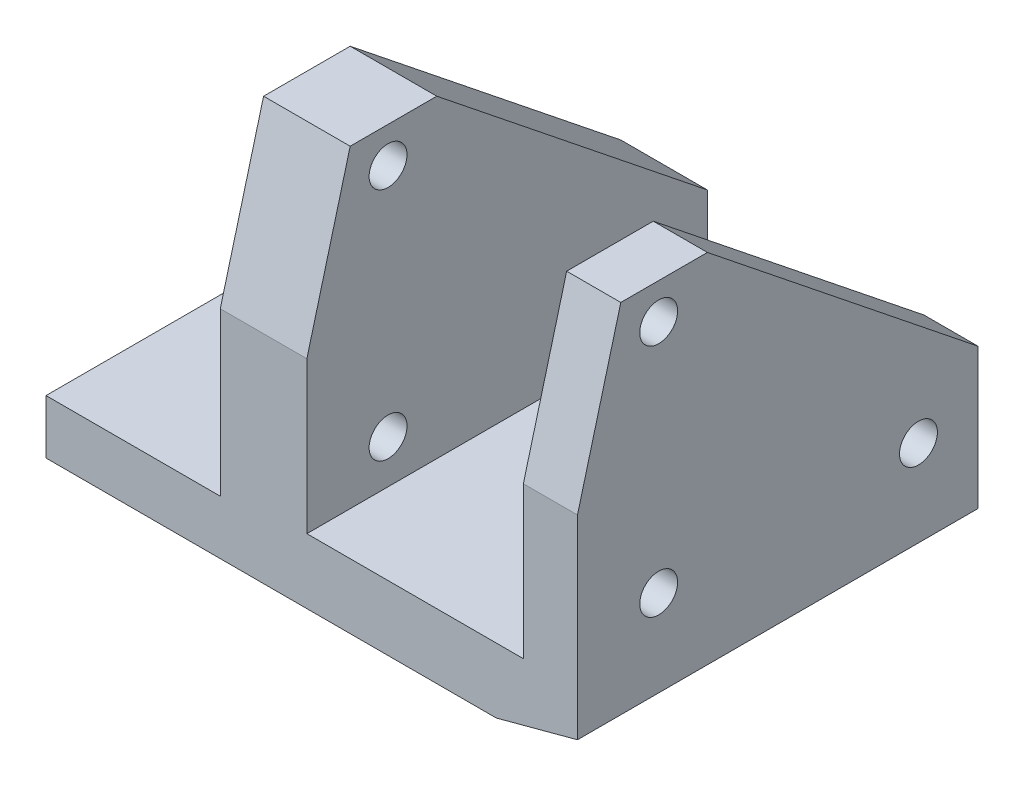
ISO-10303-21;
HEADER;
FILE_DESCRIPTION(('STEP AP214'),'2;1');
FILE_NAME('part.step','',(''),(''),'','','');
FILE_SCHEMA(('AUTOMOTIVE_DESIGN { 1 0 10303 214 1 1 1 1 }'));
ENDSEC;
DATA;
#1=APPLICATION_CONTEXT('core data for automotive mechanical design processes');
#2=APPLICATION_PROTOCOL_DEFINITION('international standard','automotive_design',2000,#1);
#3=PRODUCT_CONTEXT('',#1,'mechanical');
#4=PRODUCT('Part','Part','',(#3));
#5=PRODUCT_RELATED_PRODUCT_CATEGORY('part','',(#4));
#6=PRODUCT_DEFINITION_FORMATION('','',#4);
#7=PRODUCT_DEFINITION_CONTEXT('part definition',#1,'design');
#8=PRODUCT_DEFINITION('design','',#6,#7);
#9=PRODUCT_DEFINITION_SHAPE('','',#8);
#10=(LENGTH_UNIT() NAMED_UNIT(*) SI_UNIT(.MILLI.,.METRE.));
#11=(NAMED_UNIT(*) PLANE_ANGLE_UNIT() SI_UNIT($,.RADIAN.));
#12=(NAMED_UNIT(*) SI_UNIT($,.STERADIAN.) SOLID_ANGLE_UNIT());
#13=UNCERTAINTY_MEASURE_WITH_UNIT(LENGTH_MEASURE(1.E-05),#10,'distance_accuracy_value','');
#14=(GEOMETRIC_REPRESENTATION_CONTEXT(3) GLOBAL_UNCERTAINTY_ASSIGNED_CONTEXT((#13)) GLOBAL_UNIT_ASSIGNED_CONTEXT((#10,
#11,#12)) REPRESENTATION_CONTEXT('',''));
#15=CARTESIAN_POINT('',(0.,0.,0.));
#16=DIRECTION('',(0.,0.,1.));
#17=DIRECTION('',(1.,0.,0.));
#18=AXIS2_PLACEMENT_3D('',#15,#16,#17);
#19=CARTESIAN_POINT('',(0.,0.,5.));
#20=DIRECTION('',(0.,0.,-1.));
#21=DIRECTION('',(-1.,0.,0.));
#22=AXIS2_PLACEMENT_3D('',#19,#20,#21);
#23=PLANE('',#22);
#24=CARTESIAN_POINT('',(-6.,0.,5.));
#25=DIRECTION('',(0.,0.,1.));
#26=DIRECTION('',(1.,0.,0.));
#27=AXIS2_PLACEMENT_3D('',#24,#25,#26);
#28=CIRCLE('',#27,1.75);
#29=CARTESIAN_POINT('',(-4.25,0.,5.));
#30=VERTEX_POINT('',#29);
#31=EDGE_CURVE('E357',#30,#30,#28,.T.);
#32=ORIENTED_EDGE('',*,*,#31,.F.);
#33=EDGE_LOOP('',(#32));
#34=FACE_BOUND('',#33,.T.);
#35=CARTESIAN_POINT('',(6.,0.,5.));
#36=DIRECTION('',(0.,0.,1.));
#37=DIRECTION('',(1.,0.,0.));
#38=AXIS2_PLACEMENT_3D('',#35,#36,#37);
#39=CIRCLE('',#38,1.75);
#40=CARTESIAN_POINT('',(7.75,0.,5.));
#41=VERTEX_POINT('',#40);
#42=EDGE_CURVE('E360',#41,#41,#39,.T.);
#43=ORIENTED_EDGE('',*,*,#42,.F.);
#44=EDGE_LOOP('',(#43));
#45=FACE_BOUND('',#44,.T.);
#46=DIRECTION('',(-1.,0.,0.));
#47=VECTOR('',#46,1.);
#48=CARTESIAN_POINT('',(11.3,5.,5.));
#49=LINE('',#48,#47);
#50=CARTESIAN_POINT('',(10.8,4.99999999999999,5.));
#51=VERTEX_POINT('',#50);
#52=CARTESIAN_POINT('',(-12.8,5.,5.));
#53=VERTEX_POINT('',#52);
#54=EDGE_CURVE('E191',#51,#53,#49,.T.);
#55=ORIENTED_EDGE('',*,*,#54,.T.);
#56=DIRECTION('',(0.,-1.,0.));
#57=VECTOR('',#56,1.);
#58=CARTESIAN_POINT('',(-12.8,-5.,5.));
#59=LINE('',#58,#57);
#60=CARTESIAN_POINT('',(-12.8,-5.,5.));
#61=VERTEX_POINT('',#60);
#62=EDGE_CURVE('E200',#53,#61,#59,.T.);
#63=ORIENTED_EDGE('',*,*,#62,.T.);
#64=DIRECTION('',(1.,0.,0.));
#65=VECTOR('',#64,1.);
#66=CARTESIAN_POINT('',(-12.8,-5.,5.));
#67=LINE('',#66,#65);
#68=CARTESIAN_POINT('',(10.8,-5.,5.));
#69=VERTEX_POINT('',#68);
#70=EDGE_CURVE('E366',#61,#69,#67,.T.);
#71=ORIENTED_EDGE('',*,*,#70,.T.);
#72=DIRECTION('',(0.,-1.,0.));
#73=VECTOR('',#72,1.);
#74=CARTESIAN_POINT('',(10.8,10.,5.));
#75=LINE('',#74,#73);
#76=EDGE_CURVE('E325',#51,#69,#75,.T.);
#77=ORIENTED_EDGE('',*,*,#76,.F.);
#78=EDGE_LOOP('',(#55,#63,#71,#77));
#79=FACE_BOUND('',#78,.T.);
#80=ADVANCED_FACE('F54',(#34,#45,#79),#23,.F.);
#81=CARTESIAN_POINT('',(3.3,0.,0.));
#82=DIRECTION('',(1.,0.,0.));
#83=DIRECTION('',(0.,0.,-1.));
#84=AXIS2_PLACEMENT_3D('',#81,#82,#83);
#85=PLANE('',#84);
#86=CARTESIAN_POINT('',(3.3,15.,12.5));
#87=DIRECTION('',(-1.,0.,0.));
#88=DIRECTION('',(0.,0.,1.));
#89=AXIS2_PLACEMENT_3D('',#86,#87,#88);
#90=CIRCLE('',#89,1.75);
#91=CARTESIAN_POINT('',(3.3,15.,14.25));
#92=VERTEX_POINT('',#91);
#93=EDGE_CURVE('E275',#92,#92,#90,.T.);
#94=ORIENTED_EDGE('',*,*,#93,.F.);
#95=EDGE_LOOP('',(#94));
#96=FACE_BOUND('',#95,.T.);
#97=CARTESIAN_POINT('',(3.3,36.7,12.5));
#98=DIRECTION('',(-1.,0.,0.));
#99=DIRECTION('',(0.,0.,1.));
#100=AXIS2_PLACEMENT_3D('',#97,#98,#99);
#101=CIRCLE('',#100,1.75);
#102=CARTESIAN_POINT('',(3.3,36.7,14.25));
#103=VERTEX_POINT('',#102);
#104=EDGE_CURVE('E272',#103,#103,#101,.T.);
#105=ORIENTED_EDGE('',*,*,#104,.F.);
#106=EDGE_LOOP('',(#105));
#107=FACE_BOUND('',#106,.T.);
#108=CARTESIAN_POINT('',(3.3,15.,-11.5));
#109=DIRECTION('',(-1.,0.,0.));
#110=DIRECTION('',(0.,0.,1.));
#111=AXIS2_PLACEMENT_3D('',#108,#109,#110);
#112=CIRCLE('',#111,1.75);
#113=CARTESIAN_POINT('',(3.3,15.,-9.75));
#114=VERTEX_POINT('',#113);
#115=EDGE_CURVE('E279',#114,#114,#112,.T.);
#116=ORIENTED_EDGE('',*,*,#115,.F.);
#117=EDGE_LOOP('',(#116));
#118=FACE_BOUND('',#117,.T.);
#119=DIRECTION('',(0.,0.,1.));
#120=VECTOR('',#119,1.);
#121=CARTESIAN_POINT('',(3.3,10.,0.));
#122=LINE('',#121,#120);
#123=CARTESIAN_POINT('',(3.3,10.,-17.));
#124=VERTEX_POINT('',#123);
#125=CARTESIAN_POINT('',(3.3,10.,20.));
#126=VERTEX_POINT('',#125);
#127=EDGE_CURVE('E294',#124,#126,#122,.T.);
#128=ORIENTED_EDGE('',*,*,#127,.T.);
#129=DIRECTION('',(0.,1.,0.));
#130=VECTOR('',#129,1.);
#131=CARTESIAN_POINT('',(3.3,0.,20.));
#132=LINE('',#131,#130);
#133=CARTESIAN_POINT('',(3.3,25.,20.));
#134=VERTEX_POINT('',#133);
#135=EDGE_CURVE('E292',#126,#134,#132,.T.);
#136=ORIENTED_EDGE('',*,*,#135,.T.);
#137=DIRECTION('',(0.,0.966234939601246,-0.257662650560333));
#138=VECTOR('',#137,1.);
#139=CARTESIAN_POINT('',(3.3,6.6390041493776,24.896265560166));
#140=LINE('',#139,#138);
#141=CARTESIAN_POINT('',(3.3,40.,16.));
#142=VERTEX_POINT('',#141);
#143=EDGE_CURVE('E287',#134,#142,#140,.T.);
#144=ORIENTED_EDGE('',*,*,#143,.T.);
#145=DIRECTION('',(0.,0.,1.));
#146=VECTOR('',#145,1.);
#147=CARTESIAN_POINT('',(3.3,40.,0.));
#148=LINE('',#147,#146);
#149=CARTESIAN_POINT('',(3.3,40.,8.));
#150=VERTEX_POINT('',#149);
#151=EDGE_CURVE('E302',#150,#142,#148,.T.);
#152=ORIENTED_EDGE('',*,*,#151,.F.);
#153=DIRECTION('',(0.,0.624695047554424,0.78086880944303));
#154=VECTOR('',#153,1.);
#155=CARTESIAN_POINT('',(3.3,20.4878048780488,-16.390243902439));
#156=LINE('',#155,#154);
#157=CARTESIAN_POINT('',(3.3,20.,-17.));
#158=VERTEX_POINT('',#157);
#159=EDGE_CURVE('E299',#158,#150,#156,.T.);
#160=ORIENTED_EDGE('',*,*,#159,.F.);
#161=DIRECTION('',(0.,1.,0.));
#162=VECTOR('',#161,1.);
#163=CARTESIAN_POINT('',(3.3,0.,-17.));
#164=LINE('',#163,#162);
#165=EDGE_CURVE('E296',#124,#158,#164,.T.);
#166=ORIENTED_EDGE('',*,*,#165,.F.);
#167=EDGE_LOOP('',(#128,#136,#144,#152,#160,#166));
#168=FACE_BOUND('',#167,.T.);
#169=ADVANCED_FACE('F416',(#96,#107,#118,#168),#85,.F.);
#170=CARTESIAN_POINT('',(10.8,10.,-17.));
#171=DIRECTION('',(-1.,0.,0.));
#172=DIRECTION('',(0.,-1.,0.));
#173=AXIS2_PLACEMENT_3D('',#170,#171,#172);
#174=PLANE('',#173);
#175=DIRECTION('',(0.,0.,-1.));
#176=VECTOR('',#175,1.);
#177=CARTESIAN_POINT('',(10.8,4.99999999999999,20.));
#178=LINE('',#177,#176);
#179=CARTESIAN_POINT('',(10.8,4.99999999999999,0.));
#180=VERTEX_POINT('',#179);
#181=EDGE_CURVE('E261',#51,#180,#178,.T.);
#182=ORIENTED_EDGE('',*,*,#181,.F.);
#183=ORIENTED_EDGE('',*,*,#76,.T.);
#184=DIRECTION('',(0.,0.,1.));
#185=VECTOR('',#184,1.);
#186=CARTESIAN_POINT('',(10.8,-5.,-17.));
#187=LINE('',#186,#185);
#188=CARTESIAN_POINT('',(10.8,-5.,0.));
#189=VERTEX_POINT('',#188);
#190=EDGE_CURVE('E327',#189,#69,#187,.T.);
#191=ORIENTED_EDGE('',*,*,#190,.F.);
#192=DIRECTION('',(0.,1.,0.));
#193=VECTOR('',#192,1.);
#194=CARTESIAN_POINT('',(10.8,0.,0.));
#195=LINE('',#194,#193);
#196=EDGE_CURVE('E330',#189,#180,#195,.T.);
#197=ORIENTED_EDGE('',*,*,#196,.T.);
#198=EDGE_LOOP('',(#182,#183,#191,#197));
#199=FACE_BOUND('',#198,.T.);
#200=ADVANCED_FACE('F423',(#199),#174,.F.);
#201=CARTESIAN_POINT('',(11.3,0.,0.));
#202=DIRECTION('',(1.,0.,0.));
#203=DIRECTION('',(0.,0.,-1.));
#204=AXIS2_PLACEMENT_3D('',#201,#202,#203);
#205=PLANE('',#204);
#206=CARTESIAN_POINT('',(11.3,15.,-11.5));
#207=DIRECTION('',(-1.,0.,0.));
#208=DIRECTION('',(0.,0.,1.));
#209=AXIS2_PLACEMENT_3D('',#206,#207,#208);
#210=CIRCLE('',#209,1.75);
#211=CARTESIAN_POINT('',(11.3,15.,-9.75));
#212=VERTEX_POINT('',#211);
#213=EDGE_CURVE('E271',#212,#212,#210,.T.);
#214=ORIENTED_EDGE('',*,*,#213,.T.);
#215=EDGE_LOOP('',(#214));
#216=FACE_BOUND('',#215,.T.);
#217=CARTESIAN_POINT('',(11.3,36.7,12.5));
#218=DIRECTION('',(-1.,0.,0.));
#219=DIRECTION('',(0.,0.,1.));
#220=AXIS2_PLACEMENT_3D('',#217,#218,#219);
#221=CIRCLE('',#220,1.75);
#222=CARTESIAN_POINT('',(11.3,36.7,14.25));
#223=VERTEX_POINT('',#222);
#224=EDGE_CURVE('E276',#223,#223,#221,.T.);
#225=ORIENTED_EDGE('',*,*,#224,.T.);
#226=EDGE_LOOP('',(#225));
#227=FACE_BOUND('',#226,.T.);
#228=CARTESIAN_POINT('',(11.3,15.,12.5));
#229=DIRECTION('',(-1.,0.,0.));
#230=DIRECTION('',(0.,0.,1.));
#231=AXIS2_PLACEMENT_3D('',#228,#229,#230);
#232=CIRCLE('',#231,1.75);
#233=CARTESIAN_POINT('',(11.3,15.,14.25));
#234=VERTEX_POINT('',#233);
#235=EDGE_CURVE('E284',#234,#234,#232,.T.);
#236=ORIENTED_EDGE('',*,*,#235,.T.);
#237=EDGE_LOOP('',(#236));
#238=FACE_BOUND('',#237,.T.);
#239=DIRECTION('',(0.,1.,0.));
#240=VECTOR('',#239,1.);
#241=CARTESIAN_POINT('',(11.3,0.,20.));
#242=LINE('',#241,#240);
#243=CARTESIAN_POINT('',(11.3,11.,20.));
#244=VERTEX_POINT('',#243);
#245=CARTESIAN_POINT('',(11.3,25.,20.));
#246=VERTEX_POINT('',#245);
#247=EDGE_CURVE('E308',#244,#246,#242,.T.);
#248=ORIENTED_EDGE('',*,*,#247,.F.);
#249=DIRECTION('',(0.,0.,-1.));
#250=VECTOR('',#249,1.);
#251=CARTESIAN_POINT('',(11.3,11.,0.));
#252=LINE('',#251,#250);
#253=CARTESIAN_POINT('',(11.3,11.,-17.));
#254=VERTEX_POINT('',#253);
#255=EDGE_CURVE('E376',#244,#254,#252,.T.);
#256=ORIENTED_EDGE('',*,*,#255,.T.);
#257=DIRECTION('',(0.,1.,0.));
#258=VECTOR('',#257,1.);
#259=CARTESIAN_POINT('',(11.3,0.,-17.));
#260=LINE('',#259,#258);
#261=CARTESIAN_POINT('',(11.3,20.,-17.));
#262=VERTEX_POINT('',#261);
#263=EDGE_CURVE('E310',#254,#262,#260,.T.);
#264=ORIENTED_EDGE('',*,*,#263,.T.);
#265=DIRECTION('',(0.,0.624695047554424,0.78086880944303));
#266=VECTOR('',#265,1.);
#267=CARTESIAN_POINT('',(11.3,20.4878048780488,-16.390243902439));
#268=LINE('',#267,#266);
#269=CARTESIAN_POINT('',(11.3,40.,8.));
#270=VERTEX_POINT('',#269);
#271=EDGE_CURVE('E312',#262,#270,#268,.T.);
#272=ORIENTED_EDGE('',*,*,#271,.T.);
#273=DIRECTION('',(0.,0.,1.));
#274=VECTOR('',#273,1.);
#275=CARTESIAN_POINT('',(11.3,40.,0.));
#276=LINE('',#275,#274);
#277=CARTESIAN_POINT('',(11.3,40.,16.));
#278=VERTEX_POINT('',#277);
#279=EDGE_CURVE('E314',#270,#278,#276,.T.);
#280=ORIENTED_EDGE('',*,*,#279,.T.);
#281=DIRECTION('',(0.,0.966234939601246,-0.257662650560333));
#282=VECTOR('',#281,1.);
#283=CARTESIAN_POINT('',(11.3,6.6390041493776,24.896265560166));
#284=LINE('',#283,#282);
#285=EDGE_CURVE('E305',#246,#278,#284,.T.);
#286=ORIENTED_EDGE('',*,*,#285,.F.);
#287=EDGE_LOOP('',(#248,#256,#264,#272,#280,#286));
#288=FACE_BOUND('',#287,.T.);
#289=ADVANCED_FACE('F445',(#216,#227,#238,#288),#205,.T.);
#290=CARTESIAN_POINT('',(0.,10.,0.));
#291=DIRECTION('',(0.,1.,0.));
#292=DIRECTION('',(-1.,0.,0.));
#293=AXIS2_PLACEMENT_3D('',#290,#291,#292);
#294=PLANE('',#293);
#295=CARTESIAN_POINT('',(-0.799999999999987,10.,-12.));
#296=DIRECTION('',(0.,1.,0.));
#297=DIRECTION('',(-1.,0.,0.));
#298=AXIS2_PLACEMENT_3D('',#295,#296,#297);
#299=CIRCLE('',#298,1.75);
#300=CARTESIAN_POINT('',(-2.54999999999999,10.,-12.));
#301=VERTEX_POINT('',#300);
#302=EDGE_CURVE('E333',#301,#301,#299,.T.);
#303=ORIENTED_EDGE('',*,*,#302,.F.);
#304=EDGE_LOOP('',(#303));
#305=FACE_BOUND('',#304,.T.);
#306=DIRECTION('',(0.,0.,1.));
#307=VECTOR('',#306,1.);
#308=CARTESIAN_POINT('',(-12.8,10.,0.));
#309=LINE('',#308,#307);
#310=CARTESIAN_POINT('',(-12.8,10.,-17.));
#311=VERTEX_POINT('',#310);
#312=CARTESIAN_POINT('',(-12.8,10.,20.));
#313=VERTEX_POINT('',#312);
#314=EDGE_CURVE('E350',#311,#313,#309,.T.);
#315=ORIENTED_EDGE('',*,*,#314,.T.);
#316=DIRECTION('',(-1.,0.,0.));
#317=VECTOR('',#316,1.);
#318=CARTESIAN_POINT('',(3.3,10.,20.));
#319=LINE('',#318,#317);
#320=EDGE_CURVE('E201',#126,#313,#319,.T.);
#321=ORIENTED_EDGE('',*,*,#320,.F.);
#322=ORIENTED_EDGE('',*,*,#127,.F.);
#323=DIRECTION('',(1.,0.,0.));
#324=VECTOR('',#323,1.);
#325=CARTESIAN_POINT('',(12.8,10.,-17.));
#326=LINE('',#325,#324);
#327=EDGE_CURVE('E343',#311,#124,#326,.T.);
#328=ORIENTED_EDGE('',*,*,#327,.F.);
#329=EDGE_LOOP('',(#315,#321,#322,#328));
#330=FACE_BOUND('',#329,.T.);
#331=ADVANCED_FACE('F440',(#305,#330),#294,.T.);
#332=CARTESIAN_POINT('',(-12.8,-5.,5.));
#333=DIRECTION('',(1.,0.,0.));
#334=DIRECTION('',(0.,0.,-1.));
#335=AXIS2_PLACEMENT_3D('',#332,#333,#334);
#336=PLANE('',#335);
#337=ORIENTED_EDGE('',*,*,#314,.F.);
#338=DIRECTION('',(0.,1.,0.));
#339=VECTOR('',#338,1.);
#340=CARTESIAN_POINT('',(-12.8,10.,-17.));
#341=LINE('',#340,#339);
#342=CARTESIAN_POINT('',(-12.8,5.,-17.));
#343=VERTEX_POINT('',#342);
#344=EDGE_CURVE('E339',#343,#311,#341,.T.);
#345=ORIENTED_EDGE('',*,*,#344,.F.);
#346=DIRECTION('',(0.,0.,1.));
#347=VECTOR('',#346,1.);
#348=CARTESIAN_POINT('',(-12.8,5.,-17.));
#349=LINE('',#348,#347);
#350=CARTESIAN_POINT('',(-12.8,5.,0.));
#351=VERTEX_POINT('',#350);
#352=EDGE_CURVE('E346',#343,#351,#349,.T.);
#353=ORIENTED_EDGE('',*,*,#352,.T.);
#354=DIRECTION('',(0.,-1.,0.));
#355=VECTOR('',#354,1.);
#356=CARTESIAN_POINT('',(-12.8,-5.,0.));
#357=LINE('',#356,#355);
#358=CARTESIAN_POINT('',(-12.8,-5.,0.));
#359=VERTEX_POINT('',#358);
#360=EDGE_CURVE('E356',#351,#359,#357,.T.);
#361=ORIENTED_EDGE('',*,*,#360,.T.);
#362=DIRECTION('',(0.,0.,-1.));
#363=VECTOR('',#362,1.);
#364=CARTESIAN_POINT('',(-12.8,-5.,5.));
#365=LINE('',#364,#363);
#366=EDGE_CURVE('E370',#61,#359,#365,.T.);
#367=ORIENTED_EDGE('',*,*,#366,.F.);
#368=ORIENTED_EDGE('',*,*,#62,.F.);
#369=DIRECTION('',(0.,0.,-1.));
#370=VECTOR('',#369,1.);
#371=CARTESIAN_POINT('',(-12.8,5.,36.8585289986997));
#372=LINE('',#371,#370);
#373=CARTESIAN_POINT('',(-12.8,5.,20.));
#374=VERTEX_POINT('',#373);
#375=EDGE_CURVE('E186',#374,#53,#372,.T.);
#376=ORIENTED_EDGE('',*,*,#375,.F.);
#377=DIRECTION('',(0.,-1.,0.));
#378=VECTOR('',#377,1.);
#379=CARTESIAN_POINT('',(-12.8,10.,20.));
#380=LINE('',#379,#378);
#381=EDGE_CURVE('E197',#313,#374,#380,.T.);
#382=ORIENTED_EDGE('',*,*,#381,.F.);
#383=EDGE_LOOP('',(#337,#345,#353,#361,#367,#368,#376,#382));
#384=FACE_BOUND('',#383,.T.);
#385=ADVANCED_FACE('F196',(#384),#336,.F.);
#386=CARTESIAN_POINT('',(-12.8,-5.,5.));
#387=DIRECTION('',(0.,1.,0.));
#388=DIRECTION('',(0.,0.,1.));
#389=AXIS2_PLACEMENT_3D('',#386,#387,#388);
#390=PLANE('',#389);
#391=DIRECTION('',(1.,0.,0.));
#392=VECTOR('',#391,1.);
#393=CARTESIAN_POINT('',(-12.8,-5.,0.));
#394=LINE('',#393,#392);
#395=EDGE_CURVE('E367',#359,#189,#394,.T.);
#396=ORIENTED_EDGE('',*,*,#395,.T.);
#397=ORIENTED_EDGE('',*,*,#190,.T.);
#398=ORIENTED_EDGE('',*,*,#70,.F.);
#399=ORIENTED_EDGE('',*,*,#366,.T.);
#400=EDGE_LOOP('',(#396,#397,#398,#399));
#401=FACE_BOUND('',#400,.T.);
#402=ADVANCED_FACE('F435',(#401),#390,.F.);
#403=CARTESIAN_POINT('',(0.,0.,0.));
#404=DIRECTION('',(0.,0.,-1.));
#405=DIRECTION('',(-1.,0.,0.));
#406=AXIS2_PLACEMENT_3D('',#403,#404,#405);
#407=PLANE('',#406);
#408=ORIENTED_EDGE('',*,*,#196,.F.);
#409=ORIENTED_EDGE('',*,*,#395,.F.);
#410=ORIENTED_EDGE('',*,*,#360,.F.);
#411=DIRECTION('',(-1.,0.,0.));
#412=VECTOR('',#411,1.);
#413=CARTESIAN_POINT('',(12.8,5.,0.));
#414=LINE('',#413,#412);
#415=EDGE_CURVE('E340',#180,#351,#414,.T.);
#416=ORIENTED_EDGE('',*,*,#415,.F.);
#417=EDGE_LOOP('',(#408,#409,#410,#416));
#418=FACE_BOUND('',#417,.T.);
#419=CARTESIAN_POINT('',(-6.,0.,0.));
#420=DIRECTION('',(0.,0.,1.));
#421=DIRECTION('',(1.,0.,0.));
#422=AXIS2_PLACEMENT_3D('',#419,#420,#421);
#423=CIRCLE('',#422,1.75);
#424=CARTESIAN_POINT('',(-4.25,0.,0.));
#425=VERTEX_POINT('',#424);
#426=EDGE_CURVE('E353',#425,#425,#423,.T.);
#427=ORIENTED_EDGE('',*,*,#426,.T.);
#428=EDGE_LOOP('',(#427));
#429=FACE_BOUND('',#428,.T.);
#430=CARTESIAN_POINT('',(6.,0.,0.));
#431=DIRECTION('',(0.,0.,1.));
#432=DIRECTION('',(1.,0.,0.));
#433=AXIS2_PLACEMENT_3D('',#430,#431,#432);
#434=CIRCLE('',#433,1.75);
#435=CARTESIAN_POINT('',(7.75,0.,0.));
#436=VERTEX_POINT('',#435);
#437=EDGE_CURVE('E352',#436,#436,#434,.T.);
#438=ORIENTED_EDGE('',*,*,#437,.T.);
#439=EDGE_LOOP('',(#438));
#440=FACE_BOUND('',#439,.T.);
#441=ADVANCED_FACE('F432',(#418,#429,#440),#407,.T.);
#442=CARTESIAN_POINT('',(6.,0.,0.));
#443=DIRECTION('',(0.,0.,1.));
#444=DIRECTION('',(1.,0.,0.));
#445=AXIS2_PLACEMENT_3D('',#442,#443,#444);
#446=CYLINDRICAL_SURFACE('',#445,1.75);
#447=ORIENTED_EDGE('',*,*,#437,.F.);
#448=EDGE_LOOP('',(#447));
#449=FACE_BOUND('',#448,.T.);
#450=ORIENTED_EDGE('',*,*,#42,.T.);
#451=EDGE_LOOP('',(#450));
#452=FACE_BOUND('',#451,.T.);
#453=ADVANCED_FACE('F430',(#449,#452),#446,.F.);
#454=CARTESIAN_POINT('',(-6.,0.,0.));
#455=DIRECTION('',(0.,0.,1.));
#456=DIRECTION('',(1.,0.,0.));
#457=AXIS2_PLACEMENT_3D('',#454,#455,#456);
#458=CYLINDRICAL_SURFACE('',#457,1.75);
#459=ORIENTED_EDGE('',*,*,#426,.F.);
#460=EDGE_LOOP('',(#459));
#461=FACE_BOUND('',#460,.T.);
#462=ORIENTED_EDGE('',*,*,#31,.T.);
#463=EDGE_LOOP('',(#462));
#464=FACE_BOUND('',#463,.T.);
#465=ADVANCED_FACE('F457',(#461,#464),#458,.F.);
#466=CARTESIAN_POINT('',(12.8,5.,-17.));
#467=DIRECTION('',(0.,1.,0.));
#468=DIRECTION('',(0.,0.,1.));
#469=AXIS2_PLACEMENT_3D('',#466,#467,#468);
#470=PLANE('',#469);
#471=CARTESIAN_POINT('',(-0.799999999999987,5.,-12.));
#472=DIRECTION('',(0.,1.,0.));
#473=DIRECTION('',(0.,0.,1.));
#474=AXIS2_PLACEMENT_3D('',#471,#472,#473);
#475=CIRCLE('',#474,1.75);
#476=CARTESIAN_POINT('',(-0.799999999999987,5.,-10.25));
#477=VERTEX_POINT('',#476);
#478=EDGE_CURVE('E336',#477,#477,#475,.T.);
#479=ORIENTED_EDGE('',*,*,#478,.T.);
#480=EDGE_LOOP('',(#479));
#481=FACE_BOUND('',#480,.T.);
#482=DIRECTION('',(-1.,0.,0.));
#483=VECTOR('',#482,1.);
#484=CARTESIAN_POINT('',(12.8,5.,-17.));
#485=LINE('',#484,#483);
#486=CARTESIAN_POINT('',(28.7999999999999,5.,-17.));
#487=VERTEX_POINT('',#486);
#488=EDGE_CURVE('E337',#487,#343,#485,.T.);
#489=ORIENTED_EDGE('',*,*,#488,.F.);
#490=DIRECTION('',(0.,0.,1.));
#491=VECTOR('',#490,1.);
#492=CARTESIAN_POINT('',(28.7999999999999,5.,20.));
#493=LINE('',#492,#491);
#494=CARTESIAN_POINT('',(28.7999999999999,4.99999999999999,20.));
#495=VERTEX_POINT('',#494);
#496=EDGE_CURVE('E63',#487,#495,#493,.T.);
#497=ORIENTED_EDGE('',*,*,#496,.T.);
#498=DIRECTION('',(-1.,0.,0.));
#499=VECTOR('',#498,1.);
#500=CARTESIAN_POINT('',(11.3,4.99999999999999,20.));
#501=LINE('',#500,#499);
#502=EDGE_CURVE('E182',#495,#374,#501,.T.);
#503=ORIENTED_EDGE('',*,*,#502,.T.);
#504=ORIENTED_EDGE('',*,*,#375,.T.);
#505=ORIENTED_EDGE('',*,*,#54,.F.);
#506=ORIENTED_EDGE('',*,*,#181,.T.);
#507=ORIENTED_EDGE('',*,*,#415,.T.);
#508=ORIENTED_EDGE('',*,*,#352,.F.);
#509=EDGE_LOOP('',(#489,#497,#503,#504,#505,#506,#507,#508));
#510=FACE_BOUND('',#509,.T.);
#511=ADVANCED_FACE('F184',(#481,#510),#470,.F.);
#512=CARTESIAN_POINT('',(0.,0.,-17.));
#513=DIRECTION('',(0.,0.,-1.));
#514=DIRECTION('',(-1.,0.,0.));
#515=AXIS2_PLACEMENT_3D('',#512,#513,#514);
#516=PLANE('',#515);
#517=DIRECTION('',(0.,1.,0.));
#518=VECTOR('',#517,1.);
#519=CARTESIAN_POINT('',(36.3,0.,-17.));
#520=LINE('',#519,#518);
#521=CARTESIAN_POINT('',(36.3,7.00961894323342,-17.));
#522=VERTEX_POINT('',#521);
#523=CARTESIAN_POINT('',(36.3,20.,-17.));
#524=VERTEX_POINT('',#523);
#525=EDGE_CURVE('E212',#522,#524,#520,.T.);
#526=ORIENTED_EDGE('',*,*,#525,.F.);
#527=DIRECTION('',(-0.965925826289069,-0.258819045102518,0.));
#528=VECTOR('',#527,1.);
#529=CARTESIAN_POINT('',(0.679234185504045,-2.53493649053879,-17.));
#530=LINE('',#529,#528);
#531=EDGE_CURVE('E77',#522,#487,#530,.T.);
#532=ORIENTED_EDGE('',*,*,#531,.T.);
#533=ORIENTED_EDGE('',*,*,#488,.T.);
#534=ORIENTED_EDGE('',*,*,#344,.T.);
#535=ORIENTED_EDGE('',*,*,#327,.T.);
#536=ORIENTED_EDGE('',*,*,#165,.T.);
#537=DIRECTION('',(-1.,0.,0.));
#538=VECTOR('',#537,1.);
#539=CARTESIAN_POINT('',(11.3,20.,-17.));
#540=LINE('',#539,#538);
#541=EDGE_CURVE('E320',#262,#158,#540,.T.);
#542=ORIENTED_EDGE('',*,*,#541,.F.);
#543=ORIENTED_EDGE('',*,*,#263,.F.);
#544=DIRECTION('',(-1.,0.,0.));
#545=VECTOR('',#544,1.);
#546=CARTESIAN_POINT('',(31.3,11.,-17.));
#547=LINE('',#546,#545);
#548=CARTESIAN_POINT('',(31.3,11.,-17.));
#549=VERTEX_POINT('',#548);
#550=EDGE_CURVE('E269',#549,#254,#547,.T.);
#551=ORIENTED_EDGE('',*,*,#550,.F.);
#552=DIRECTION('',(0.,1.,0.));
#553=VECTOR('',#552,1.);
#554=CARTESIAN_POINT('',(31.3,0.,-17.));
#555=LINE('',#554,#553);
#556=CARTESIAN_POINT('',(31.3,20.,-17.));
#557=VERTEX_POINT('',#556);
#558=EDGE_CURVE('E206',#549,#557,#555,.T.);
#559=ORIENTED_EDGE('',*,*,#558,.T.);
#560=DIRECTION('',(-1.,0.,0.));
#561=VECTOR('',#560,1.);
#562=CARTESIAN_POINT('',(36.3,20.,-17.));
#563=LINE('',#562,#561);
#564=EDGE_CURVE('E258',#524,#557,#563,.T.);
#565=ORIENTED_EDGE('',*,*,#564,.F.);
#566=EDGE_LOOP('',(#526,#532,#533,#534,#535,#536,#542,#543,#551,#559,#565));
#567=FACE_BOUND('',#566,.T.);
#568=ADVANCED_FACE('F392',(#567),#516,.T.);
#569=CARTESIAN_POINT('',(-0.799999999999985,-10.,-12.));
#570=DIRECTION('',(0.,1.,0.));
#571=DIRECTION('',(-1.,0.,0.));
#572=AXIS2_PLACEMENT_3D('',#569,#570,#571);
#573=CYLINDRICAL_SURFACE('',#572,1.75);
#574=ORIENTED_EDGE('',*,*,#302,.T.);
#575=EDGE_LOOP('',(#574));
#576=FACE_BOUND('',#575,.T.);
#577=ORIENTED_EDGE('',*,*,#478,.F.);
#578=EDGE_LOOP('',(#577));
#579=FACE_BOUND('',#578,.T.);
#580=ADVANCED_FACE('F554',(#576,#579),#573,.F.);
#581=CARTESIAN_POINT('',(11.3,6.6390041493776,24.896265560166));
#582=DIRECTION('',(0.,0.257662650560333,0.966234939601246));
#583=DIRECTION('',(0.,-0.966234939601246,0.257662650560332));
#584=AXIS2_PLACEMENT_3D('',#581,#582,#583);
#585=PLANE('',#584);
#586=DIRECTION('',(-1.,0.,0.));
#587=VECTOR('',#586,1.);
#588=CARTESIAN_POINT('',(11.3,40.,16.));
#589=LINE('',#588,#587);
#590=EDGE_CURVE('E316',#278,#142,#589,.T.);
#591=ORIENTED_EDGE('',*,*,#590,.T.);
#592=ORIENTED_EDGE('',*,*,#143,.F.);
#593=DIRECTION('',(-1.,0.,0.));
#594=VECTOR('',#593,1.);
#595=CARTESIAN_POINT('',(11.3,25.,20.));
#596=LINE('',#595,#594);
#597=EDGE_CURVE('E190',#246,#134,#596,.T.);
#598=ORIENTED_EDGE('',*,*,#597,.F.);
#599=ORIENTED_EDGE('',*,*,#285,.T.);
#600=EDGE_LOOP('',(#591,#592,#598,#599));
#601=FACE_BOUND('',#600,.T.);
#602=ADVANCED_FACE('F491',(#601),#585,.T.);
#603=CARTESIAN_POINT('',(11.3,0.,20.));
#604=DIRECTION('',(0.,0.,1.));
#605=DIRECTION('',(1.,0.,0.));
#606=AXIS2_PLACEMENT_3D('',#603,#604,#605);
#607=PLANE('',#606);
#608=ORIENTED_EDGE('',*,*,#502,.F.);
#609=DIRECTION('',(0.965925826289069,0.258819045102518,0.));
#610=VECTOR('',#609,1.);
#611=CARTESIAN_POINT('',(11.2222777168861,0.29006350946118,20.));
#612=LINE('',#611,#610);
#613=CARTESIAN_POINT('',(36.3,7.00961894323342,20.));
#614=VERTEX_POINT('',#613);
#615=EDGE_CURVE('E12',#495,#614,#612,.T.);
#616=ORIENTED_EDGE('',*,*,#615,.T.);
#617=DIRECTION('',(0.,-1.,0.));
#618=VECTOR('',#617,1.);
#619=CARTESIAN_POINT('',(36.3,0.,20.));
#620=LINE('',#619,#618);
#621=CARTESIAN_POINT('',(36.3,25.,20.));
#622=VERTEX_POINT('',#621);
#623=EDGE_CURVE('E221',#622,#614,#620,.T.);
#624=ORIENTED_EDGE('',*,*,#623,.F.);
#625=DIRECTION('',(-1.,0.,0.));
#626=VECTOR('',#625,1.);
#627=CARTESIAN_POINT('',(36.3,25.,20.));
#628=LINE('',#627,#626);
#629=CARTESIAN_POINT('',(31.3,25.,20.));
#630=VERTEX_POINT('',#629);
#631=EDGE_CURVE('E232',#622,#630,#628,.T.);
#632=ORIENTED_EDGE('',*,*,#631,.T.);
#633=DIRECTION('',(0.,-1.,0.));
#634=VECTOR('',#633,1.);
#635=CARTESIAN_POINT('',(31.3,0.,20.));
#636=LINE('',#635,#634);
#637=CARTESIAN_POINT('',(31.3,11.,20.));
#638=VERTEX_POINT('',#637);
#639=EDGE_CURVE('E239',#630,#638,#636,.T.);
#640=ORIENTED_EDGE('',*,*,#639,.T.);
#641=DIRECTION('',(-1.,0.,0.));
#642=VECTOR('',#641,1.);
#643=CARTESIAN_POINT('',(31.3,11.,20.));
#644=LINE('',#643,#642);
#645=EDGE_CURVE('E265',#638,#244,#644,.T.);
#646=ORIENTED_EDGE('',*,*,#645,.T.);
#647=ORIENTED_EDGE('',*,*,#247,.T.);
#648=ORIENTED_EDGE('',*,*,#597,.T.);
#649=ORIENTED_EDGE('',*,*,#135,.F.);
#650=ORIENTED_EDGE('',*,*,#320,.T.);
#651=ORIENTED_EDGE('',*,*,#381,.T.);
#652=EDGE_LOOP('',(#608,#616,#624,#632,#640,#646,#647,#648,#649,#650,#651));
#653=FACE_BOUND('',#652,.T.);
#654=ADVANCED_FACE('F203',(#653),#607,.T.);
#655=CARTESIAN_POINT('',(11.3,20.4878048780488,-16.390243902439));
#656=DIRECTION('',(0.,-0.780868809443031,0.624695047554424));
#657=DIRECTION('',(0.,-0.624695047554424,-0.78086880944303));
#658=AXIS2_PLACEMENT_3D('',#655,#656,#657);
#659=PLANE('',#658);
#660=ORIENTED_EDGE('',*,*,#541,.T.);
#661=ORIENTED_EDGE('',*,*,#159,.T.);
#662=DIRECTION('',(-1.,0.,0.));
#663=VECTOR('',#662,1.);
#664=CARTESIAN_POINT('',(11.3,40.,8.));
#665=LINE('',#664,#663);
#666=EDGE_CURVE('E318',#270,#150,#665,.T.);
#667=ORIENTED_EDGE('',*,*,#666,.F.);
#668=ORIENTED_EDGE('',*,*,#271,.F.);
#669=EDGE_LOOP('',(#660,#661,#667,#668));
#670=FACE_BOUND('',#669,.T.);
#671=ADVANCED_FACE('F500',(#670),#659,.F.);
#672=CARTESIAN_POINT('',(11.3,40.,0.));
#673=DIRECTION('',(0.,-1.,0.));
#674=DIRECTION('',(0.,0.,-1.));
#675=AXIS2_PLACEMENT_3D('',#672,#673,#674);
#676=PLANE('',#675);
#677=ORIENTED_EDGE('',*,*,#666,.T.);
#678=ORIENTED_EDGE('',*,*,#151,.T.);
#679=ORIENTED_EDGE('',*,*,#590,.F.);
#680=ORIENTED_EDGE('',*,*,#279,.F.);
#681=EDGE_LOOP('',(#677,#678,#679,#680));
#682=FACE_BOUND('',#681,.T.);
#683=ADVANCED_FACE('F495',(#682),#676,.F.);
#684=CARTESIAN_POINT('',(11.3,15.,12.5));
#685=DIRECTION('',(-1.,0.,0.));
#686=DIRECTION('',(0.,0.,1.));
#687=AXIS2_PLACEMENT_3D('',#684,#685,#686);
#688=CYLINDRICAL_SURFACE('',#687,1.75);
#689=ORIENTED_EDGE('',*,*,#235,.F.);
#690=EDGE_LOOP('',(#689));
#691=FACE_BOUND('',#690,.T.);
#692=ORIENTED_EDGE('',*,*,#93,.T.);
#693=EDGE_LOOP('',(#692));
#694=FACE_BOUND('',#693,.T.);
#695=ADVANCED_FACE('F538',(#691,#694),#688,.F.);
#696=CARTESIAN_POINT('',(11.3,36.7,12.5));
#697=DIRECTION('',(-1.,0.,0.));
#698=DIRECTION('',(0.,0.,1.));
#699=AXIS2_PLACEMENT_3D('',#696,#697,#698);
#700=CYLINDRICAL_SURFACE('',#699,1.75);
#701=ORIENTED_EDGE('',*,*,#224,.F.);
#702=EDGE_LOOP('',(#701));
#703=FACE_BOUND('',#702,.T.);
#704=ORIENTED_EDGE('',*,*,#104,.T.);
#705=EDGE_LOOP('',(#704));
#706=FACE_BOUND('',#705,.T.);
#707=ADVANCED_FACE('F535',(#703,#706),#700,.F.);
#708=CARTESIAN_POINT('',(11.3,15.,-11.5));
#709=DIRECTION('',(-1.,0.,0.));
#710=DIRECTION('',(0.,0.,1.));
#711=AXIS2_PLACEMENT_3D('',#708,#709,#710);
#712=CYLINDRICAL_SURFACE('',#711,1.75);
#713=ORIENTED_EDGE('',*,*,#213,.F.);
#714=EDGE_LOOP('',(#713));
#715=FACE_BOUND('',#714,.T.);
#716=ORIENTED_EDGE('',*,*,#115,.T.);
#717=EDGE_LOOP('',(#716));
#718=FACE_BOUND('',#717,.T.);
#719=ADVANCED_FACE('F517',(#715,#718),#712,.F.);
#720=CARTESIAN_POINT('',(31.3,11.,20.));
#721=DIRECTION('',(0.,-1.,0.));
#722=DIRECTION('',(1.,0.,0.));
#723=AXIS2_PLACEMENT_3D('',#720,#721,#722);
#724=PLANE('',#723);
#725=ORIENTED_EDGE('',*,*,#255,.F.);
#726=ORIENTED_EDGE('',*,*,#645,.F.);
#727=DIRECTION('',(0.,0.,1.));
#728=VECTOR('',#727,1.);
#729=CARTESIAN_POINT('',(31.3,11.,20.));
#730=LINE('',#729,#728);
#731=EDGE_CURVE('E262',#549,#638,#730,.T.);
#732=ORIENTED_EDGE('',*,*,#731,.F.);
#733=ORIENTED_EDGE('',*,*,#550,.T.);
#734=EDGE_LOOP('',(#725,#726,#732,#733));
#735=FACE_BOUND('',#734,.T.);
#736=ADVANCED_FACE('F505',(#735),#724,.F.);
#737=CARTESIAN_POINT('',(31.3,0.,0.));
#738=DIRECTION('',(1.,0.,0.));
#739=DIRECTION('',(0.,0.,-1.));
#740=AXIS2_PLACEMENT_3D('',#737,#738,#739);
#741=PLANE('',#740);
#742=CARTESIAN_POINT('',(31.3,15.,12.5));
#743=DIRECTION('',(1.,0.,0.));
#744=DIRECTION('',(0.,0.,-1.));
#745=AXIS2_PLACEMENT_3D('',#742,#743,#744);
#746=CIRCLE('',#745,1.75);
#747=CARTESIAN_POINT('',(31.3,15.,10.75));
#748=VERTEX_POINT('',#747);
#749=EDGE_CURVE('E242',#748,#748,#746,.T.);
#750=ORIENTED_EDGE('',*,*,#749,.T.);
#751=EDGE_LOOP('',(#750));
#752=FACE_BOUND('',#751,.T.);
#753=CARTESIAN_POINT('',(31.3,36.7,12.5));
#754=DIRECTION('',(1.,0.,0.));
#755=DIRECTION('',(0.,0.,-1.));
#756=AXIS2_PLACEMENT_3D('',#753,#754,#755);
#757=CIRCLE('',#756,1.75);
#758=CARTESIAN_POINT('',(31.3,36.7,10.75));
#759=VERTEX_POINT('',#758);
#760=EDGE_CURVE('E245',#759,#759,#757,.T.);
#761=ORIENTED_EDGE('',*,*,#760,.T.);
#762=EDGE_LOOP('',(#761));
#763=FACE_BOUND('',#762,.T.);
#764=CARTESIAN_POINT('',(31.3,15.,-11.5));
#765=DIRECTION('',(1.,0.,0.));
#766=DIRECTION('',(0.,0.,-1.));
#767=AXIS2_PLACEMENT_3D('',#764,#765,#766);
#768=CIRCLE('',#767,1.75);
#769=CARTESIAN_POINT('',(31.3,15.,-13.25));
#770=VERTEX_POINT('',#769);
#771=EDGE_CURVE('E215',#770,#770,#768,.T.);
#772=ORIENTED_EDGE('',*,*,#771,.T.);
#773=EDGE_LOOP('',(#772));
#774=FACE_BOUND('',#773,.T.);
#775=ORIENTED_EDGE('',*,*,#558,.F.);
#776=ORIENTED_EDGE('',*,*,#731,.T.);
#777=ORIENTED_EDGE('',*,*,#639,.F.);
#778=DIRECTION('',(0.,-0.966234939601246,0.257662650560333));
#779=VECTOR('',#778,1.);
#780=CARTESIAN_POINT('',(31.3,6.6390041493776,24.896265560166));
#781=LINE('',#780,#779);
#782=CARTESIAN_POINT('',(31.3,40.,16.));
#783=VERTEX_POINT('',#782);
#784=EDGE_CURVE('E237',#783,#630,#781,.T.);
#785=ORIENTED_EDGE('',*,*,#784,.F.);
#786=DIRECTION('',(0.,0.,1.));
#787=VECTOR('',#786,1.);
#788=CARTESIAN_POINT('',(31.3,40.,0.));
#789=LINE('',#788,#787);
#790=CARTESIAN_POINT('',(31.3,40.,8.));
#791=VERTEX_POINT('',#790);
#792=EDGE_CURVE('E235',#791,#783,#789,.T.);
#793=ORIENTED_EDGE('',*,*,#792,.F.);
#794=DIRECTION('',(0.,0.624695047554424,0.78086880944303));
#795=VECTOR('',#794,1.);
#796=CARTESIAN_POINT('',(31.3,20.4878048780488,-16.390243902439));
#797=LINE('',#796,#795);
#798=EDGE_CURVE('E208',#557,#791,#797,.T.);
#799=ORIENTED_EDGE('',*,*,#798,.F.);
#800=EDGE_LOOP('',(#775,#776,#777,#785,#793,#799));
#801=FACE_BOUND('',#800,.T.);
#802=ADVANCED_FACE('F508',(#752,#763,#774,#801),#741,.F.);
#803=CARTESIAN_POINT('',(36.3,20.4878048780488,-16.390243902439));
#804=DIRECTION('',(0.,-0.78086880944303,0.624695047554424));
#805=DIRECTION('',(0.,-0.624695047554424,-0.78086880944303));
#806=AXIS2_PLACEMENT_3D('',#803,#804,#805);
#807=PLANE('',#806);
#808=ORIENTED_EDGE('',*,*,#798,.T.);
#809=DIRECTION('',(-1.,0.,0.));
#810=VECTOR('',#809,1.);
#811=CARTESIAN_POINT('',(36.3,40.,8.));
#812=LINE('',#811,#810);
#813=CARTESIAN_POINT('',(36.3,40.,8.));
#814=VERTEX_POINT('',#813);
#815=EDGE_CURVE('E255',#814,#791,#812,.T.);
#816=ORIENTED_EDGE('',*,*,#815,.F.);
#817=DIRECTION('',(0.,0.624695047554424,0.78086880944303));
#818=VECTOR('',#817,1.);
#819=CARTESIAN_POINT('',(36.3,20.4878048780488,-16.390243902439));
#820=LINE('',#819,#818);
#821=EDGE_CURVE('E214',#524,#814,#820,.T.);
#822=ORIENTED_EDGE('',*,*,#821,.F.);
#823=ORIENTED_EDGE('',*,*,#564,.T.);
#824=EDGE_LOOP('',(#808,#816,#822,#823));
#825=FACE_BOUND('',#824,.T.);
#826=ADVANCED_FACE('F396',(#825),#807,.F.);
#827=CARTESIAN_POINT('',(36.3,40.,0.));
#828=DIRECTION('',(0.,-1.,0.));
#829=DIRECTION('',(0.,0.,-1.));
#830=AXIS2_PLACEMENT_3D('',#827,#828,#829);
#831=PLANE('',#830);
#832=ORIENTED_EDGE('',*,*,#792,.T.);
#833=DIRECTION('',(-1.,0.,0.));
#834=VECTOR('',#833,1.);
#835=CARTESIAN_POINT('',(36.3,40.,16.));
#836=LINE('',#835,#834);
#837=CARTESIAN_POINT('',(36.3,40.,16.));
#838=VERTEX_POINT('',#837);
#839=EDGE_CURVE('E252',#838,#783,#836,.T.);
#840=ORIENTED_EDGE('',*,*,#839,.F.);
#841=DIRECTION('',(0.,0.,1.));
#842=VECTOR('',#841,1.);
#843=CARTESIAN_POINT('',(36.3,40.,0.));
#844=LINE('',#843,#842);
#845=EDGE_CURVE('E217',#814,#838,#844,.T.);
#846=ORIENTED_EDGE('',*,*,#845,.F.);
#847=ORIENTED_EDGE('',*,*,#815,.T.);
#848=EDGE_LOOP('',(#832,#840,#846,#847));
#849=FACE_BOUND('',#848,.T.);
#850=ADVANCED_FACE('F403',(#849),#831,.F.);
#851=CARTESIAN_POINT('',(36.3,6.6390041493776,24.896265560166));
#852=DIRECTION('',(0.,-0.257662650560332,-0.966234939601246));
#853=DIRECTION('',(0.,0.966234939601246,-0.257662650560332));
#854=AXIS2_PLACEMENT_3D('',#851,#852,#853);
#855=PLANE('',#854);
#856=ORIENTED_EDGE('',*,*,#784,.T.);
#857=ORIENTED_EDGE('',*,*,#631,.F.);
#858=DIRECTION('',(0.,-0.966234939601246,0.257662650560333));
#859=VECTOR('',#858,1.);
#860=CARTESIAN_POINT('',(36.3,6.6390041493776,24.896265560166));
#861=LINE('',#860,#859);
#862=EDGE_CURVE('E219',#838,#622,#861,.T.);
#863=ORIENTED_EDGE('',*,*,#862,.F.);
#864=ORIENTED_EDGE('',*,*,#839,.T.);
#865=EDGE_LOOP('',(#856,#857,#863,#864));
#866=FACE_BOUND('',#865,.T.);
#867=ADVANCED_FACE('F407',(#866),#855,.F.);
#868=CARTESIAN_POINT('',(36.3,36.7,12.5));
#869=DIRECTION('',(-1.,0.,0.));
#870=DIRECTION('',(0.,0.,1.));
#871=AXIS2_PLACEMENT_3D('',#868,#869,#870);
#872=CYLINDRICAL_SURFACE('',#871,1.75);
#873=CARTESIAN_POINT('',(36.3,36.7,12.5));
#874=DIRECTION('',(1.,0.,0.));
#875=DIRECTION('',(0.,0.,-1.));
#876=AXIS2_PLACEMENT_3D('',#873,#874,#875);
#877=CIRCLE('',#876,1.75);
#878=CARTESIAN_POINT('',(36.3,36.7,10.75));
#879=VERTEX_POINT('',#878);
#880=EDGE_CURVE('E227',#879,#879,#877,.T.);
#881=ORIENTED_EDGE('',*,*,#880,.T.);
#882=EDGE_LOOP('',(#881));
#883=FACE_BOUND('',#882,.T.);
#884=ORIENTED_EDGE('',*,*,#760,.F.);
#885=EDGE_LOOP('',(#884));
#886=FACE_BOUND('',#885,.T.);
#887=ADVANCED_FACE('F524',(#883,#886),#872,.F.);
#888=CARTESIAN_POINT('',(36.3,15.,12.5));
#889=DIRECTION('',(-1.,0.,0.));
#890=DIRECTION('',(0.,0.,1.));
#891=AXIS2_PLACEMENT_3D('',#888,#889,#890);
#892=CYLINDRICAL_SURFACE('',#891,1.75);
#893=CARTESIAN_POINT('',(36.3,15.,12.5));
#894=DIRECTION('',(1.,0.,0.));
#895=DIRECTION('',(0.,0.,-1.));
#896=AXIS2_PLACEMENT_3D('',#893,#894,#895);
#897=CIRCLE('',#896,1.75);
#898=CARTESIAN_POINT('',(36.3,15.,10.75));
#899=VERTEX_POINT('',#898);
#900=EDGE_CURVE('E224',#899,#899,#897,.T.);
#901=ORIENTED_EDGE('',*,*,#900,.T.);
#902=EDGE_LOOP('',(#901));
#903=FACE_BOUND('',#902,.T.);
#904=ORIENTED_EDGE('',*,*,#749,.F.);
#905=EDGE_LOOP('',(#904));
#906=FACE_BOUND('',#905,.T.);
#907=ADVANCED_FACE('F522',(#903,#906),#892,.F.);
#908=CARTESIAN_POINT('',(36.3,15.,-11.5));
#909=DIRECTION('',(-1.,0.,0.));
#910=DIRECTION('',(0.,0.,1.));
#911=AXIS2_PLACEMENT_3D('',#908,#909,#910);
#912=CYLINDRICAL_SURFACE('',#911,1.75);
#913=CARTESIAN_POINT('',(36.3,15.,-11.5));
#914=DIRECTION('',(1.,0.,0.));
#915=DIRECTION('',(0.,0.,-1.));
#916=AXIS2_PLACEMENT_3D('',#913,#914,#915);
#917=CIRCLE('',#916,1.75);
#918=CARTESIAN_POINT('',(36.3,15.,-13.25));
#919=VERTEX_POINT('',#918);
#920=EDGE_CURVE('E230',#919,#919,#917,.T.);
#921=ORIENTED_EDGE('',*,*,#920,.T.);
#922=EDGE_LOOP('',(#921));
#923=FACE_BOUND('',#922,.T.);
#924=ORIENTED_EDGE('',*,*,#771,.F.);
#925=EDGE_LOOP('',(#924));
#926=FACE_BOUND('',#925,.T.);
#927=ADVANCED_FACE('F413',(#923,#926),#912,.F.);
#928=CARTESIAN_POINT('',(36.3,0.,0.));
#929=DIRECTION('',(1.,0.,0.));
#930=DIRECTION('',(0.,0.,-1.));
#931=AXIS2_PLACEMENT_3D('',#928,#929,#930);
#932=PLANE('',#931);
#933=ORIENTED_EDGE('',*,*,#623,.T.);
#934=DIRECTION('',(0.,0.,-1.));
#935=VECTOR('',#934,1.);
#936=CARTESIAN_POINT('',(36.3,7.00961894323342,-17.));
#937=LINE('',#936,#935);
#938=EDGE_CURVE('E381',#614,#522,#937,.T.);
#939=ORIENTED_EDGE('',*,*,#938,.T.);
#940=ORIENTED_EDGE('',*,*,#525,.T.);
#941=ORIENTED_EDGE('',*,*,#821,.T.);
#942=ORIENTED_EDGE('',*,*,#845,.T.);
#943=ORIENTED_EDGE('',*,*,#862,.T.);
#944=EDGE_LOOP('',(#933,#939,#940,#941,#942,#943));
#945=FACE_BOUND('',#944,.T.);
#946=ORIENTED_EDGE('',*,*,#900,.F.);
#947=EDGE_LOOP('',(#946));
#948=FACE_BOUND('',#947,.T.);
#949=ORIENTED_EDGE('',*,*,#880,.F.);
#950=EDGE_LOOP('',(#949));
#951=FACE_BOUND('',#950,.T.);
#952=ORIENTED_EDGE('',*,*,#920,.F.);
#953=EDGE_LOOP('',(#952));
#954=FACE_BOUND('',#953,.T.);
#955=ADVANCED_FACE('F386',(#945,#948,#951,#954),#932,.T.);
#956=CARTESIAN_POINT('',(36.3,7.00961894323342,0.));
#957=DIRECTION('',(0.258819045102518,-0.965925826289069,0.));
#958=DIRECTION('',(0.,0.,1.));
#959=AXIS2_PLACEMENT_3D('',#956,#957,#958);
#960=PLANE('',#959);
#961=ORIENTED_EDGE('',*,*,#615,.F.);
#962=ORIENTED_EDGE('',*,*,#496,.F.);
#963=ORIENTED_EDGE('',*,*,#531,.F.);
#964=ORIENTED_EDGE('',*,*,#938,.F.);
#965=EDGE_LOOP('',(#961,#962,#963,#964));
#966=FACE_BOUND('',#965,.T.);
#967=ADVANCED_FACE('F57',(#966),#960,.T.);
#968=CLOSED_SHELL('',(#80,#169,#200,#289,#331,#385,#402,#441,#453,#465,#511,#568,#580,#602,#654,
#671,#683,#695,#707,#719,#736,#802,#826,#850,#867,#887,#907,#927,#955,#967));
#969=MANIFOLD_SOLID_BREP('B2',#968);
#970=ADVANCED_BREP_SHAPE_REPRESENTATION('',(#18,#969),#14);
#971=SHAPE_DEFINITION_REPRESENTATION(#9,#970);
ENDSEC;
END-ISO-10303-21;
